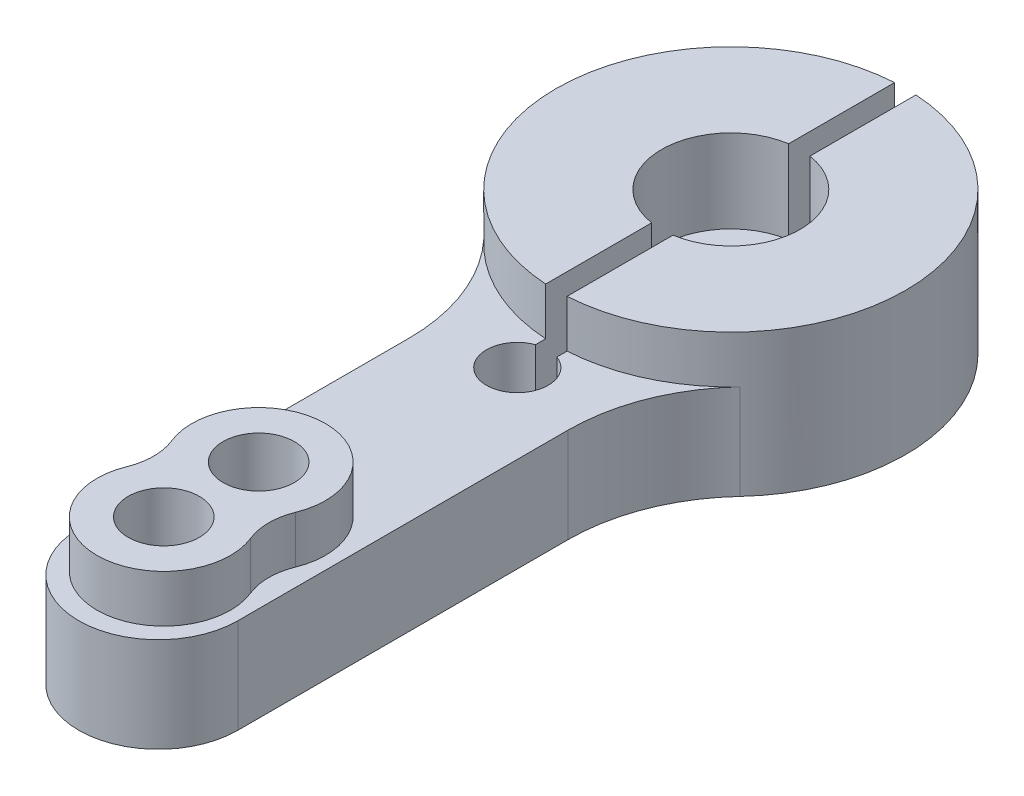
ISO-10303-21;
HEADER;
FILE_DESCRIPTION(('STEP AP214'),'2;1');
FILE_NAME('part.step','',(''),(''),'','','');
FILE_SCHEMA(('AUTOMOTIVE_DESIGN { 1 0 10303 214 1 1 1 1 }'));
ENDSEC;
DATA;
#1=APPLICATION_CONTEXT('core data for automotive mechanical design processes');
#2=APPLICATION_PROTOCOL_DEFINITION('international standard','automotive_design',2000,#1);
#3=PRODUCT_CONTEXT('',#1,'mechanical');
#4=PRODUCT('Part','Part','',(#3));
#5=PRODUCT_RELATED_PRODUCT_CATEGORY('part','',(#4));
#6=PRODUCT_DEFINITION_FORMATION('','',#4);
#7=PRODUCT_DEFINITION_CONTEXT('part definition',#1,'design');
#8=PRODUCT_DEFINITION('design','',#6,#7);
#9=PRODUCT_DEFINITION_SHAPE('','',#8);
#10=(LENGTH_UNIT() NAMED_UNIT(*) SI_UNIT(.MILLI.,.METRE.));
#11=(NAMED_UNIT(*) PLANE_ANGLE_UNIT() SI_UNIT($,.RADIAN.));
#12=(NAMED_UNIT(*) SI_UNIT($,.STERADIAN.) SOLID_ANGLE_UNIT());
#13=UNCERTAINTY_MEASURE_WITH_UNIT(LENGTH_MEASURE(1.E-05),#10,'distance_accuracy_value','');
#14=(GEOMETRIC_REPRESENTATION_CONTEXT(3) GLOBAL_UNCERTAINTY_ASSIGNED_CONTEXT((#13)) GLOBAL_UNIT_ASSIGNED_CONTEXT((#10,
#11,#12)) REPRESENTATION_CONTEXT('',''));
#15=CARTESIAN_POINT('',(0.,0.,0.));
#16=DIRECTION('',(0.,0.,1.));
#17=DIRECTION('',(1.,0.,0.));
#18=AXIS2_PLACEMENT_3D('',#15,#16,#17);
#19=CARTESIAN_POINT('',(0.,-4.,0.));
#20=DIRECTION('',(0.,1.,0.));
#21=DIRECTION('',(0.,0.,1.));
#22=AXIS2_PLACEMENT_3D('',#19,#20,#21);
#23=CYLINDRICAL_SURFACE('',#22,1.4);
#24=DIRECTION('',(0.,1.,0.));
#25=VECTOR('',#24,1.);
#26=CARTESIAN_POINT('',(-0.450000000000001,-4.,1.32570735835628));
#27=LINE('',#26,#25);
#28=CARTESIAN_POINT('',(-0.45,-2.6284,1.32570735835628));
#29=VERTEX_POINT('',#28);
#30=CARTESIAN_POINT('',(-0.45,-1.5052,1.32570735835628));
#31=VERTEX_POINT('',#30);
#32=EDGE_CURVE('E414',#29,#31,#27,.T.);
#33=ORIENTED_EDGE('',*,*,#32,.F.);
#34=CARTESIAN_POINT('',(0.,-2.6284,0.));
#35=DIRECTION('',(0.,-1.,0.));
#36=DIRECTION('',(0.,0.,-1.));
#37=AXIS2_PLACEMENT_3D('',#34,#35,#36);
#38=CIRCLE('',#37,1.4);
#39=CARTESIAN_POINT('',(-0.45,-2.6284,-1.32570735835629));
#40=VERTEX_POINT('',#39);
#41=EDGE_CURVE('E262',#29,#40,#38,.T.);
#42=ORIENTED_EDGE('',*,*,#41,.T.);
#43=DIRECTION('',(0.,1.,0.));
#44=VECTOR('',#43,1.);
#45=CARTESIAN_POINT('',(-0.45,-4.,-1.32570735835629));
#46=LINE('',#45,#44);
#47=CARTESIAN_POINT('',(-0.449999999999999,-1.5052,-1.32570735835629));
#48=VERTEX_POINT('',#47);
#49=EDGE_CURVE('E412',#40,#48,#46,.T.);
#50=ORIENTED_EDGE('',*,*,#49,.T.);
#51=CARTESIAN_POINT('',(0.,-1.5052,0.));
#52=DIRECTION('',(0.,1.,0.));
#53=DIRECTION('',(0.,0.,1.));
#54=AXIS2_PLACEMENT_3D('',#51,#52,#53);
#55=CIRCLE('',#54,1.4);
#56=EDGE_CURVE('E292',#48,#31,#55,.T.);
#57=ORIENTED_EDGE('',*,*,#56,.T.);
#58=EDGE_LOOP('',(#33,#42,#50,#57));
#59=FACE_BOUND('',#58,.T.);
#60=ADVANCED_FACE('F45',(#59),#23,.F.);
#61=CARTESIAN_POINT('',(0.,-4.,0.));
#62=DIRECTION('',(0.,1.,0.));
#63=DIRECTION('',(0.,0.,1.));
#64=AXIS2_PLACEMENT_3D('',#61,#62,#63);
#65=CYLINDRICAL_SURFACE('',#64,1.4);
#66=DIRECTION('',(0.,1.,0.));
#67=VECTOR('',#66,1.);
#68=CARTESIAN_POINT('',(0.450000000000001,-4.,-1.32570735835629));
#69=LINE('',#68,#67);
#70=CARTESIAN_POINT('',(0.450000000000001,-2.6284,-1.32570735835628));
#71=VERTEX_POINT('',#70);
#72=CARTESIAN_POINT('',(0.450000000000001,-1.5052,-1.32570735835628));
#73=VERTEX_POINT('',#72);
#74=EDGE_CURVE('E423',#71,#73,#69,.T.);
#75=ORIENTED_EDGE('',*,*,#74,.F.);
#76=CARTESIAN_POINT('',(0.,-2.6284,0.));
#77=DIRECTION('',(0.,-1.,0.));
#78=DIRECTION('',(0.,0.,-1.));
#79=AXIS2_PLACEMENT_3D('',#76,#77,#78);
#80=CIRCLE('',#79,1.4);
#81=CARTESIAN_POINT('',(0.450000000000001,-2.6284,1.32570735835628));
#82=VERTEX_POINT('',#81);
#83=EDGE_CURVE('E235',#71,#82,#80,.T.);
#84=ORIENTED_EDGE('',*,*,#83,.T.);
#85=DIRECTION('',(0.,1.,0.));
#86=VECTOR('',#85,1.);
#87=CARTESIAN_POINT('',(0.450000000000001,-4.,1.32570735835628));
#88=LINE('',#87,#86);
#89=CARTESIAN_POINT('',(0.450000000000001,-1.5052,1.32570735835629));
#90=VERTEX_POINT('',#89);
#91=EDGE_CURVE('E421',#82,#90,#88,.T.);
#92=ORIENTED_EDGE('',*,*,#91,.T.);
#93=CARTESIAN_POINT('',(0.,-1.5052,0.));
#94=DIRECTION('',(0.,1.,0.));
#95=DIRECTION('',(0.,0.,1.));
#96=AXIS2_PLACEMENT_3D('',#93,#94,#95);
#97=CIRCLE('',#96,1.4);
#98=EDGE_CURVE('E283',#90,#73,#97,.T.);
#99=ORIENTED_EDGE('',*,*,#98,.T.);
#100=EDGE_LOOP('',(#75,#84,#92,#99));
#101=FACE_BOUND('',#100,.T.);
#102=ADVANCED_FACE('F467',(#101),#65,.F.);
#103=CARTESIAN_POINT('',(0.,0.,24.13));
#104=DIRECTION('',(0.,1.,0.));
#105=DIRECTION('',(0.,0.,1.));
#106=AXIS2_PLACEMENT_3D('',#103,#104,#105);
#107=PLANE('',#106);
#108=DIRECTION('',(0.,0.,-1.));
#109=VECTOR('',#108,1.);
#110=CARTESIAN_POINT('',(3.3528,0.,24.13));
#111=LINE('',#110,#109);
#112=CARTESIAN_POINT('',(3.3528,0.,24.13));
#113=VERTEX_POINT('',#112);
#114=CARTESIAN_POINT('',(3.3528,0.,10.2067554178593));
#115=VERTEX_POINT('',#114);
#116=EDGE_CURVE('E396',#113,#115,#111,.T.);
#117=ORIENTED_EDGE('',*,*,#116,.T.);
#118=CARTESIAN_POINT('',(10.9728,0.,10.2067554178593));
#119=DIRECTION('',(0.,1.,0.));
#120=DIRECTION('',(0.,0.,1.));
#121=AXIS2_PLACEMENT_3D('',#118,#119,#120);
#122=CIRCLE('',#121,7.62);
#123=CARTESIAN_POINT('',(5.39341016949152,0.,5.01687978165965));
#124=VERTEX_POINT('',#123);
#125=EDGE_CURVE('E444',#115,#124,#122,.F.);
#126=ORIENTED_EDGE('',*,*,#125,.T.);
#127=CARTESIAN_POINT('',(0.,0.,0.));
#128=DIRECTION('',(0.,1.,0.));
#129=DIRECTION('',(0.,0.,1.));
#130=AXIS2_PLACEMENT_3D('',#127,#128,#129);
#131=CIRCLE('',#130,7.366);
#132=CARTESIAN_POINT('',(0.45,0.,7.35224156295208));
#133=VERTEX_POINT('',#132);
#134=EDGE_CURVE('E333',#133,#124,#131,.T.);
#135=ORIENTED_EDGE('',*,*,#134,.F.);
#136=DIRECTION('',(0.,0.,1.));
#137=VECTOR('',#136,1.);
#138=CARTESIAN_POINT('',(0.450000000000001,0.,1.32570735835628));
#139=LINE('',#138,#137);
#140=CARTESIAN_POINT('',(0.450000000000003,0.,7.78036890823495));
#141=VERTEX_POINT('',#140);
#142=EDGE_CURVE('E399',#133,#141,#139,.T.);
#143=ORIENTED_EDGE('',*,*,#142,.T.);
#144=CARTESIAN_POINT('',(0.,0.,9.));
#145=DIRECTION('',(0.,-1.,0.));
#146=DIRECTION('',(0.,0.,1.));
#147=AXIS2_PLACEMENT_3D('',#144,#145,#146);
#148=CIRCLE('',#147,1.3);
#149=CARTESIAN_POINT('',(-0.45,0.,7.78036890823495));
#150=VERTEX_POINT('',#149);
#151=EDGE_CURVE('E401',#141,#150,#148,.T.);
#152=ORIENTED_EDGE('',*,*,#151,.T.);
#153=DIRECTION('',(0.,0.,-1.));
#154=VECTOR('',#153,1.);
#155=CARTESIAN_POINT('',(-0.45,0.,7.78036890823495));
#156=LINE('',#155,#154);
#157=CARTESIAN_POINT('',(-0.449999999999999,0.,7.35224156295208));
#158=VERTEX_POINT('',#157);
#159=EDGE_CURVE('E404',#150,#158,#156,.T.);
#160=ORIENTED_EDGE('',*,*,#159,.T.);
#161=CARTESIAN_POINT('',(0.,0.,0.));
#162=DIRECTION('',(0.,1.,0.));
#163=DIRECTION('',(0.,0.,1.));
#164=AXIS2_PLACEMENT_3D('',#161,#162,#163);
#165=CIRCLE('',#164,7.366);
#166=CARTESIAN_POINT('',(-5.39341016949153,0.,5.01687978165965));
#167=VERTEX_POINT('',#166);
#168=EDGE_CURVE('E354',#167,#158,#165,.T.);
#169=ORIENTED_EDGE('',*,*,#168,.F.);
#170=CARTESIAN_POINT('',(-10.9728,0.,10.2067554178593));
#171=DIRECTION('',(0.,1.,0.));
#172=DIRECTION('',(0.,0.,1.));
#173=AXIS2_PLACEMENT_3D('',#170,#171,#172);
#174=CIRCLE('',#173,7.62);
#175=CARTESIAN_POINT('',(-3.3528,0.,10.2067554178593));
#176=VERTEX_POINT('',#175);
#177=EDGE_CURVE('E440',#167,#176,#174,.F.);
#178=ORIENTED_EDGE('',*,*,#177,.T.);
#179=DIRECTION('',(0.,0.,1.));
#180=VECTOR('',#179,1.);
#181=CARTESIAN_POINT('',(-3.3528,0.,24.13));
#182=LINE('',#181,#180);
#183=CARTESIAN_POINT('',(-3.3528,0.,24.13));
#184=VERTEX_POINT('',#183);
#185=EDGE_CURVE('E372',#176,#184,#182,.T.);
#186=ORIENTED_EDGE('',*,*,#185,.T.);
#187=CARTESIAN_POINT('',(0.,0.,24.13));
#188=DIRECTION('',(0.,1.,0.));
#189=DIRECTION('',(0.,0.,1.));
#190=AXIS2_PLACEMENT_3D('',#187,#188,#189);
#191=CIRCLE('',#190,3.3528);
#192=EDGE_CURVE('E367',#184,#113,#191,.T.);
#193=ORIENTED_EDGE('',*,*,#192,.T.);
#194=EDGE_LOOP('',(#117,#126,#135,#143,#152,#160,#169,#178,#186,#193));
#195=FACE_BOUND('',#194,.T.);
#196=CARTESIAN_POINT('',(0.,0.,19.9));
#197=DIRECTION('',(0.,1.,0.));
#198=DIRECTION('',(0.,0.,1.));
#199=AXIS2_PLACEMENT_3D('',#196,#197,#198);
#200=CIRCLE('',#199,2.815);
#201=CARTESIAN_POINT('',(2.61129853325274,0.,20.9513538748833));
#202=VERTEX_POINT('',#201);
#203=CARTESIAN_POINT('',(-2.61129853325274,0.,20.9513538748833));
#204=VERTEX_POINT('',#203);
#205=EDGE_CURVE('E318',#202,#204,#200,.T.);
#206=ORIENTED_EDGE('',*,*,#205,.F.);
#207=CARTESIAN_POINT('',(4.96749685455361,0.,21.9));
#208=DIRECTION('',(0.,-1.,0.));
#209=DIRECTION('',(0.,0.,1.));
#210=AXIS2_PLACEMENT_3D('',#207,#208,#209);
#211=CIRCLE('',#210,2.54);
#212=CARTESIAN_POINT('',(2.61129853325274,0.,22.8486461251167));
#213=VERTEX_POINT('',#212);
#214=EDGE_CURVE('E304',#213,#202,#211,.T.);
#215=ORIENTED_EDGE('',*,*,#214,.F.);
#216=CARTESIAN_POINT('',(0.,0.,23.9));
#217=DIRECTION('',(0.,1.,0.));
#218=DIRECTION('',(0.,0.,1.));
#219=AXIS2_PLACEMENT_3D('',#216,#217,#218);
#220=CIRCLE('',#219,2.815);
#221=CARTESIAN_POINT('',(-2.61129853325274,0.,22.8486461251167));
#222=VERTEX_POINT('',#221);
#223=EDGE_CURVE('E309',#222,#213,#220,.T.);
#224=ORIENTED_EDGE('',*,*,#223,.F.);
#225=CARTESIAN_POINT('',(-4.96749685455361,0.,21.9));
#226=DIRECTION('',(0.,-1.,0.));
#227=DIRECTION('',(0.,0.,-1.));
#228=AXIS2_PLACEMENT_3D('',#225,#226,#227);
#229=CIRCLE('',#228,2.54);
#230=EDGE_CURVE('E320',#204,#222,#229,.T.);
#231=ORIENTED_EDGE('',*,*,#230,.F.);
#232=EDGE_LOOP('',(#206,#215,#224,#231));
#233=FACE_BOUND('',#232,.T.);
#234=ADVANCED_FACE('F495',(#195,#233),#107,.T.);
#235=CARTESIAN_POINT('',(0.,-4.,24.13));
#236=DIRECTION('',(0.,1.,0.));
#237=DIRECTION('',(0.,0.,1.));
#238=AXIS2_PLACEMENT_3D('',#235,#236,#237);
#239=CYLINDRICAL_SURFACE('',#238,3.3528);
#240=ORIENTED_EDGE('',*,*,#192,.F.);
#241=DIRECTION('',(0.,1.,0.));
#242=VECTOR('',#241,1.);
#243=CARTESIAN_POINT('',(-3.3528,-4.,24.13));
#244=LINE('',#243,#242);
#245=CARTESIAN_POINT('',(-3.3528,-4.,24.13));
#246=VERTEX_POINT('',#245);
#247=EDGE_CURVE('E358',#246,#184,#244,.T.);
#248=ORIENTED_EDGE('',*,*,#247,.F.);
#249=CARTESIAN_POINT('',(0.,-4.,24.13));
#250=DIRECTION('',(0.,1.,0.));
#251=DIRECTION('',(0.,0.,1.));
#252=AXIS2_PLACEMENT_3D('',#249,#250,#251);
#253=CIRCLE('',#252,3.3528);
#254=CARTESIAN_POINT('',(3.3528,-4.,24.13));
#255=VERTEX_POINT('',#254);
#256=EDGE_CURVE('E368',#246,#255,#253,.T.);
#257=ORIENTED_EDGE('',*,*,#256,.T.);
#258=DIRECTION('',(0.,1.,0.));
#259=VECTOR('',#258,1.);
#260=CARTESIAN_POINT('',(3.3528,-4.,24.13));
#261=LINE('',#260,#259);
#262=EDGE_CURVE('E393',#255,#113,#261,.T.);
#263=ORIENTED_EDGE('',*,*,#262,.T.);
#264=EDGE_LOOP('',(#240,#248,#257,#263));
#265=FACE_BOUND('',#264,.T.);
#266=ADVANCED_FACE('F502',(#265),#239,.T.);
#267=CARTESIAN_POINT('',(-3.3528,-4.,24.13));
#268=DIRECTION('',(-1.,0.,0.));
#269=DIRECTION('',(0.,0.,1.));
#270=AXIS2_PLACEMENT_3D('',#267,#268,#269);
#271=PLANE('',#270);
#272=ORIENTED_EDGE('',*,*,#185,.F.);
#273=DIRECTION('',(0.,-1.,0.));
#274=VECTOR('',#273,1.);
#275=CARTESIAN_POINT('',(-3.3528,-4.,10.2067554178593));
#276=LINE('',#275,#274);
#277=CARTESIAN_POINT('',(-3.3528,-4.,10.2067554178593));
#278=VERTEX_POINT('',#277);
#279=EDGE_CURVE('E433',#176,#278,#276,.T.);
#280=ORIENTED_EDGE('',*,*,#279,.T.);
#281=DIRECTION('',(0.,0.,1.));
#282=VECTOR('',#281,1.);
#283=CARTESIAN_POINT('',(-3.3528,-4.,24.13));
#284=LINE('',#283,#282);
#285=EDGE_CURVE('E391',#278,#246,#284,.T.);
#286=ORIENTED_EDGE('',*,*,#285,.T.);
#287=ORIENTED_EDGE('',*,*,#247,.T.);
#288=EDGE_LOOP('',(#272,#280,#286,#287));
#289=FACE_BOUND('',#288,.T.);
#290=ADVANCED_FACE('F578',(#289),#271,.T.);
#291=CARTESIAN_POINT('',(0.,-4.,0.));
#292=DIRECTION('',(0.,1.,0.));
#293=DIRECTION('',(0.,0.,1.));
#294=AXIS2_PLACEMENT_3D('',#291,#292,#293);
#295=CYLINDRICAL_SURFACE('',#294,7.366);
#296=CARTESIAN_POINT('',(0.,-4.,0.));
#297=DIRECTION('',(0.,1.,0.));
#298=DIRECTION('',(0.,0.,1.));
#299=AXIS2_PLACEMENT_3D('',#296,#297,#298);
#300=CIRCLE('',#299,7.366);
#301=CARTESIAN_POINT('',(-0.449999999999999,-4.,-7.35224156295208));
#302=VERTEX_POINT('',#301);
#303=CARTESIAN_POINT('',(-5.39341016949153,-4.,5.01687978165965));
#304=VERTEX_POINT('',#303);
#305=EDGE_CURVE('E388',#302,#304,#300,.T.);
#306=ORIENTED_EDGE('',*,*,#305,.T.);
#307=DIRECTION('',(0.,1.,0.));
#308=VECTOR('',#307,1.);
#309=CARTESIAN_POINT('',(-5.39341016949152,-4.,5.01687978165965));
#310=LINE('',#309,#308);
#311=EDGE_CURVE('E430',#304,#167,#310,.T.);
#312=ORIENTED_EDGE('',*,*,#311,.T.);
#313=ORIENTED_EDGE('',*,*,#168,.T.);
#314=DIRECTION('',(0.,-1.,0.));
#315=VECTOR('',#314,1.);
#316=CARTESIAN_POINT('',(-0.449999999999999,2.,7.35224156295208));
#317=LINE('',#316,#315);
#318=CARTESIAN_POINT('',(-0.449999999999999,2.,7.35224156295208));
#319=VERTEX_POINT('',#318);
#320=EDGE_CURVE('E353',#319,#158,#317,.T.);
#321=ORIENTED_EDGE('',*,*,#320,.F.);
#322=CARTESIAN_POINT('',(0.,2.,0.));
#323=DIRECTION('',(0.,1.,0.));
#324=DIRECTION('',(0.,0.,1.));
#325=AXIS2_PLACEMENT_3D('',#322,#323,#324);
#326=CIRCLE('',#325,7.366);
#327=CARTESIAN_POINT('',(-0.449999999999995,2.,-7.35224156295208));
#328=VERTEX_POINT('',#327);
#329=EDGE_CURVE('E348',#328,#319,#326,.T.);
#330=ORIENTED_EDGE('',*,*,#329,.F.);
#331=DIRECTION('',(0.,1.,0.));
#332=VECTOR('',#331,1.);
#333=CARTESIAN_POINT('',(-0.449999999999999,-4.,-7.35224156295208));
#334=LINE('',#333,#332);
#335=EDGE_CURVE('E409',#302,#328,#334,.T.);
#336=ORIENTED_EDGE('',*,*,#335,.F.);
#337=EDGE_LOOP('',(#306,#312,#313,#321,#330,#336));
#338=FACE_BOUND('',#337,.T.);
#339=ADVANCED_FACE('F513',(#338),#295,.T.);
#340=CARTESIAN_POINT('',(-0.45,-4.,-1.32570735835629));
#341=DIRECTION('',(1.,0.,0.));
#342=DIRECTION('',(0.,0.,-1.));
#343=AXIS2_PLACEMENT_3D('',#340,#341,#342);
#344=PLANE('',#343);
#345=DIRECTION('',(0.,-1.,0.));
#346=VECTOR('',#345,1.);
#347=CARTESIAN_POINT('',(-0.45,-2.6284,-3.84727205302666));
#348=LINE('',#347,#346);
#349=CARTESIAN_POINT('',(-0.45,-4.,-3.84727205302666));
#350=VERTEX_POINT('',#349);
#351=CARTESIAN_POINT('',(-0.45,-2.6284,-3.84727205302666));
#352=VERTEX_POINT('',#351);
#353=EDGE_CURVE('E254',#350,#352,#348,.F.);
#354=ORIENTED_EDGE('',*,*,#353,.F.);
#355=DIRECTION('',(0.,0.,-1.));
#356=VECTOR('',#355,1.);
#357=CARTESIAN_POINT('',(-0.45,-4.,-1.32570735835629));
#358=LINE('',#357,#356);
#359=EDGE_CURVE('E386',#350,#302,#358,.T.);
#360=ORIENTED_EDGE('',*,*,#359,.T.);
#361=ORIENTED_EDGE('',*,*,#335,.T.);
#362=DIRECTION('',(0.,0.,-1.));
#363=VECTOR('',#362,1.);
#364=CARTESIAN_POINT('',(-0.449999999999999,2.,-7.35224156295208));
#365=LINE('',#364,#363);
#366=CARTESIAN_POINT('',(-0.449999999999999,2.,-2.88612906849295));
#367=VERTEX_POINT('',#366);
#368=EDGE_CURVE('E346',#367,#328,#365,.T.);
#369=ORIENTED_EDGE('',*,*,#368,.F.);
#370=DIRECTION('',(0.,1.,0.));
#371=VECTOR('',#370,1.);
#372=CARTESIAN_POINT('',(-0.45,-1.5052,-2.88612906849295));
#373=LINE('',#372,#371);
#374=CARTESIAN_POINT('',(-0.45,-1.5052,-2.88612906849295));
#375=VERTEX_POINT('',#374);
#376=EDGE_CURVE('E281',#375,#367,#373,.T.);
#377=ORIENTED_EDGE('',*,*,#376,.F.);
#378=DIRECTION('',(0.,0.,1.));
#379=VECTOR('',#378,1.);
#380=CARTESIAN_POINT('',(-0.45,-1.5052,-1.32570735835629));
#381=LINE('',#380,#379);
#382=EDGE_CURVE('E295',#375,#48,#381,.T.);
#383=ORIENTED_EDGE('',*,*,#382,.T.);
#384=ORIENTED_EDGE('',*,*,#49,.F.);
#385=DIRECTION('',(0.,0.,-1.));
#386=VECTOR('',#385,1.);
#387=CARTESIAN_POINT('',(-0.45,-2.6284,-1.32570735835629));
#388=LINE('',#387,#386);
#389=EDGE_CURVE('E265',#40,#352,#388,.T.);
#390=ORIENTED_EDGE('',*,*,#389,.T.);
#391=EDGE_LOOP('',(#354,#360,#361,#369,#377,#383,#384,#390));
#392=FACE_BOUND('',#391,.T.);
#393=ADVANCED_FACE('F519',(#392),#344,.T.);
#394=CARTESIAN_POINT('',(-0.45,-4.,7.78036890823495));
#395=DIRECTION('',(1.,0.,0.));
#396=DIRECTION('',(0.,0.,-1.));
#397=AXIS2_PLACEMENT_3D('',#394,#395,#396);
#398=PLANE('',#397);
#399=DIRECTION('',(0.,-1.,0.));
#400=VECTOR('',#399,1.);
#401=CARTESIAN_POINT('',(-0.45,-2.6284,3.84727205302666));
#402=LINE('',#401,#400);
#403=CARTESIAN_POINT('',(-0.45,-2.6284,3.84727205302666));
#404=VERTEX_POINT('',#403);
#405=CARTESIAN_POINT('',(-0.45,-4.,3.84727205302666));
#406=VERTEX_POINT('',#405);
#407=EDGE_CURVE('E68',#404,#406,#402,.T.);
#408=ORIENTED_EDGE('',*,*,#407,.F.);
#409=DIRECTION('',(0.,0.,-1.));
#410=VECTOR('',#409,1.);
#411=CARTESIAN_POINT('',(-0.45,-2.6284,7.78036890823495));
#412=LINE('',#411,#410);
#413=EDGE_CURVE('E259',#404,#29,#412,.T.);
#414=ORIENTED_EDGE('',*,*,#413,.T.);
#415=ORIENTED_EDGE('',*,*,#32,.T.);
#416=DIRECTION('',(0.,0.,1.));
#417=VECTOR('',#416,1.);
#418=CARTESIAN_POINT('',(-0.45,-1.5052,7.78036890823495));
#419=LINE('',#418,#417);
#420=CARTESIAN_POINT('',(-0.45,-1.5052,2.88612906849295));
#421=VERTEX_POINT('',#420);
#422=EDGE_CURVE('E289',#31,#421,#419,.T.);
#423=ORIENTED_EDGE('',*,*,#422,.T.);
#424=DIRECTION('',(0.,1.,0.));
#425=VECTOR('',#424,1.);
#426=CARTESIAN_POINT('',(-0.45,-1.5052,2.88612906849295));
#427=LINE('',#426,#425);
#428=CARTESIAN_POINT('',(-0.449999999999999,2.,2.88612906849295));
#429=VERTEX_POINT('',#428);
#430=EDGE_CURVE('E279',#429,#421,#427,.F.);
#431=ORIENTED_EDGE('',*,*,#430,.F.);
#432=DIRECTION('',(0.,0.,-1.));
#433=VECTOR('',#432,1.);
#434=CARTESIAN_POINT('',(-0.449999999999999,2.,1.32570735835628));
#435=LINE('',#434,#433);
#436=EDGE_CURVE('E350',#319,#429,#435,.T.);
#437=ORIENTED_EDGE('',*,*,#436,.F.);
#438=ORIENTED_EDGE('',*,*,#320,.T.);
#439=ORIENTED_EDGE('',*,*,#159,.F.);
#440=DIRECTION('',(0.,1.,0.));
#441=VECTOR('',#440,1.);
#442=CARTESIAN_POINT('',(-0.45,-4.,7.78036890823495));
#443=LINE('',#442,#441);
#444=CARTESIAN_POINT('',(-0.45,-4.,7.78036890823495));
#445=VERTEX_POINT('',#444);
#446=EDGE_CURVE('E416',#445,#150,#443,.T.);
#447=ORIENTED_EDGE('',*,*,#446,.F.);
#448=DIRECTION('',(0.,0.,-1.));
#449=VECTOR('',#448,1.);
#450=CARTESIAN_POINT('',(-0.45,-4.,7.78036890823495));
#451=LINE('',#450,#449);
#452=EDGE_CURVE('E383',#445,#406,#451,.T.);
#453=ORIENTED_EDGE('',*,*,#452,.T.);
#454=EDGE_LOOP('',(#408,#414,#415,#423,#431,#437,#438,#439,#447,#453));
#455=FACE_BOUND('',#454,.T.);
#456=ADVANCED_FACE('F457',(#455),#398,.T.);
#457=CARTESIAN_POINT('',(0.,-4.,9.));
#458=DIRECTION('',(0.,1.,0.));
#459=DIRECTION('',(0.,0.,1.));
#460=AXIS2_PLACEMENT_3D('',#457,#458,#459);
#461=CYLINDRICAL_SURFACE('',#460,1.3);
#462=ORIENTED_EDGE('',*,*,#151,.F.);
#463=DIRECTION('',(0.,1.,0.));
#464=VECTOR('',#463,1.);
#465=CARTESIAN_POINT('',(0.450000000000003,-4.,7.78036890823495));
#466=LINE('',#465,#464);
#467=CARTESIAN_POINT('',(0.450000000000003,-4.,7.78036890823495));
#468=VERTEX_POINT('',#467);
#469=EDGE_CURVE('E418',#468,#141,#466,.T.);
#470=ORIENTED_EDGE('',*,*,#469,.F.);
#471=CARTESIAN_POINT('',(0.,-4.,9.));
#472=DIRECTION('',(0.,-1.,0.));
#473=DIRECTION('',(0.,0.,1.));
#474=AXIS2_PLACEMENT_3D('',#471,#472,#473);
#475=CIRCLE('',#474,1.3);
#476=EDGE_CURVE('E380',#468,#445,#475,.T.);
#477=ORIENTED_EDGE('',*,*,#476,.T.);
#478=ORIENTED_EDGE('',*,*,#446,.T.);
#479=EDGE_LOOP('',(#462,#470,#477,#478));
#480=FACE_BOUND('',#479,.T.);
#481=ADVANCED_FACE('F461',(#480),#461,.F.);
#482=CARTESIAN_POINT('',(0.450000000000001,-4.,1.32570735835628));
#483=DIRECTION('',(-1.,0.,0.));
#484=DIRECTION('',(0.,0.,1.));
#485=AXIS2_PLACEMENT_3D('',#482,#483,#484);
#486=PLANE('',#485);
#487=DIRECTION('',(0.,-1.,0.));
#488=VECTOR('',#487,1.);
#489=CARTESIAN_POINT('',(0.450000000000001,-2.6284,3.84727205302666));
#490=LINE('',#489,#488);
#491=CARTESIAN_POINT('',(0.450000000000001,-4.,3.84727205302666));
#492=VERTEX_POINT('',#491);
#493=CARTESIAN_POINT('',(0.450000000000001,-2.6284,3.84727205302666));
#494=VERTEX_POINT('',#493);
#495=EDGE_CURVE('E240',#492,#494,#490,.F.);
#496=ORIENTED_EDGE('',*,*,#495,.F.);
#497=DIRECTION('',(0.,0.,1.));
#498=VECTOR('',#497,1.);
#499=CARTESIAN_POINT('',(0.450000000000001,-4.,1.32570735835628));
#500=LINE('',#499,#498);
#501=EDGE_CURVE('E378',#492,#468,#500,.T.);
#502=ORIENTED_EDGE('',*,*,#501,.T.);
#503=ORIENTED_EDGE('',*,*,#469,.T.);
#504=ORIENTED_EDGE('',*,*,#142,.F.);
#505=DIRECTION('',(0.,-1.,0.));
#506=VECTOR('',#505,1.);
#507=CARTESIAN_POINT('',(0.45,2.,7.35224156295208));
#508=LINE('',#507,#506);
#509=CARTESIAN_POINT('',(0.45,2.,7.35224156295208));
#510=VERTEX_POINT('',#509);
#511=EDGE_CURVE('E342',#510,#133,#508,.T.);
#512=ORIENTED_EDGE('',*,*,#511,.F.);
#513=DIRECTION('',(0.,0.,1.));
#514=VECTOR('',#513,1.);
#515=CARTESIAN_POINT('',(0.45,2.,1.32570735835628));
#516=LINE('',#515,#514);
#517=CARTESIAN_POINT('',(0.45,2.,2.88612906849295));
#518=VERTEX_POINT('',#517);
#519=EDGE_CURVE('E340',#518,#510,#516,.T.);
#520=ORIENTED_EDGE('',*,*,#519,.F.);
#521=DIRECTION('',(0.,1.,0.));
#522=VECTOR('',#521,1.);
#523=CARTESIAN_POINT('',(0.450000000000001,-1.5052,2.88612906849295));
#524=LINE('',#523,#522);
#525=CARTESIAN_POINT('',(0.450000000000001,-1.5052,2.88612906849295));
#526=VERTEX_POINT('',#525);
#527=EDGE_CURVE('E277',#526,#518,#524,.T.);
#528=ORIENTED_EDGE('',*,*,#527,.F.);
#529=DIRECTION('',(0.,0.,-1.));
#530=VECTOR('',#529,1.);
#531=CARTESIAN_POINT('',(0.450000000000001,-1.5052,1.32570735835628));
#532=LINE('',#531,#530);
#533=EDGE_CURVE('E286',#526,#90,#532,.T.);
#534=ORIENTED_EDGE('',*,*,#533,.T.);
#535=ORIENTED_EDGE('',*,*,#91,.F.);
#536=DIRECTION('',(0.,0.,1.));
#537=VECTOR('',#536,1.);
#538=CARTESIAN_POINT('',(0.450000000000001,-2.6284,1.32570735835628));
#539=LINE('',#538,#537);
#540=EDGE_CURVE('E257',#82,#494,#539,.T.);
#541=ORIENTED_EDGE('',*,*,#540,.T.);
#542=EDGE_LOOP('',(#496,#502,#503,#504,#512,#520,#528,#534,#535,#541));
#543=FACE_BOUND('',#542,.T.);
#544=ADVANCED_FACE('F464',(#543),#486,.T.);
#545=CARTESIAN_POINT('',(0.45,-4.,-7.35224156295208));
#546=DIRECTION('',(-1.,0.,0.));
#547=DIRECTION('',(0.,0.,1.));
#548=AXIS2_PLACEMENT_3D('',#545,#546,#547);
#549=PLANE('',#548);
#550=DIRECTION('',(0.,-1.,0.));
#551=VECTOR('',#550,1.);
#552=CARTESIAN_POINT('',(0.45,-2.6284,-3.84727205302666));
#553=LINE('',#552,#551);
#554=CARTESIAN_POINT('',(0.45,-2.6284,-3.84727205302666));
#555=VERTEX_POINT('',#554);
#556=CARTESIAN_POINT('',(0.45,-4.,-3.84727205302666));
#557=VERTEX_POINT('',#556);
#558=EDGE_CURVE('E60',#555,#557,#553,.T.);
#559=ORIENTED_EDGE('',*,*,#558,.F.);
#560=DIRECTION('',(0.,0.,1.));
#561=VECTOR('',#560,1.);
#562=CARTESIAN_POINT('',(0.45,-2.6284,-7.35224156295208));
#563=LINE('',#562,#561);
#564=EDGE_CURVE('E11',#555,#71,#563,.T.);
#565=ORIENTED_EDGE('',*,*,#564,.T.);
#566=ORIENTED_EDGE('',*,*,#74,.T.);
#567=DIRECTION('',(0.,0.,-1.));
#568=VECTOR('',#567,1.);
#569=CARTESIAN_POINT('',(0.45,-1.5052,-7.35224156295208));
#570=LINE('',#569,#568);
#571=CARTESIAN_POINT('',(0.450000000000001,-1.5052,-2.88612906849295));
#572=VERTEX_POINT('',#571);
#573=EDGE_CURVE('E357',#73,#572,#570,.T.);
#574=ORIENTED_EDGE('',*,*,#573,.T.);
#575=DIRECTION('',(0.,1.,0.));
#576=VECTOR('',#575,1.);
#577=CARTESIAN_POINT('',(0.450000000000001,-1.5052,-2.88612906849295));
#578=LINE('',#577,#576);
#579=CARTESIAN_POINT('',(0.45,2.,-2.88612906849295));
#580=VERTEX_POINT('',#579);
#581=EDGE_CURVE('E272',#580,#572,#578,.F.);
#582=ORIENTED_EDGE('',*,*,#581,.F.);
#583=DIRECTION('',(0.,0.,1.));
#584=VECTOR('',#583,1.);
#585=CARTESIAN_POINT('',(0.45,2.,-7.35224156295208));
#586=LINE('',#585,#584);
#587=CARTESIAN_POINT('',(0.45,2.,-7.35224156295208));
#588=VERTEX_POINT('',#587);
#589=EDGE_CURVE('E337',#588,#580,#586,.T.);
#590=ORIENTED_EDGE('',*,*,#589,.F.);
#591=DIRECTION('',(0.,1.,0.));
#592=VECTOR('',#591,1.);
#593=CARTESIAN_POINT('',(0.45,-4.,-7.35224156295208));
#594=LINE('',#593,#592);
#595=CARTESIAN_POINT('',(0.45,-4.,-7.35224156295208));
#596=VERTEX_POINT('',#595);
#597=EDGE_CURVE('E425',#596,#588,#594,.T.);
#598=ORIENTED_EDGE('',*,*,#597,.F.);
#599=DIRECTION('',(0.,0.,1.));
#600=VECTOR('',#599,1.);
#601=CARTESIAN_POINT('',(0.45,-4.,-7.35224156295208));
#602=LINE('',#601,#600);
#603=EDGE_CURVE('E247',#596,#557,#602,.T.);
#604=ORIENTED_EDGE('',*,*,#603,.T.);
#605=EDGE_LOOP('',(#559,#565,#566,#574,#582,#590,#598,#604));
#606=FACE_BOUND('',#605,.T.);
#607=ADVANCED_FACE('F244',(#606),#549,.T.);
#608=CARTESIAN_POINT('',(0.,-4.,0.));
#609=DIRECTION('',(0.,1.,0.));
#610=DIRECTION('',(0.,0.,1.));
#611=AXIS2_PLACEMENT_3D('',#608,#609,#610);
#612=CYLINDRICAL_SURFACE('',#611,7.366);
#613=ORIENTED_EDGE('',*,*,#134,.T.);
#614=DIRECTION('',(0.,1.,0.));
#615=VECTOR('',#614,1.);
#616=CARTESIAN_POINT('',(5.39341016949152,-4.,5.01687978165965));
#617=LINE('',#616,#615);
#618=CARTESIAN_POINT('',(5.39341016949153,-4.,5.01687978165965));
#619=VERTEX_POINT('',#618);
#620=EDGE_CURVE('E438',#124,#619,#617,.F.);
#621=ORIENTED_EDGE('',*,*,#620,.T.);
#622=CARTESIAN_POINT('',(0.,-4.,0.));
#623=DIRECTION('',(0.,1.,0.));
#624=DIRECTION('',(0.,0.,1.));
#625=AXIS2_PLACEMENT_3D('',#622,#623,#624);
#626=CIRCLE('',#625,7.366);
#627=EDGE_CURVE('E375',#619,#596,#626,.T.);
#628=ORIENTED_EDGE('',*,*,#627,.T.);
#629=ORIENTED_EDGE('',*,*,#597,.T.);
#630=CARTESIAN_POINT('',(0.,2.,0.));
#631=DIRECTION('',(0.,1.,0.));
#632=DIRECTION('',(0.,0.,1.));
#633=AXIS2_PLACEMENT_3D('',#630,#631,#632);
#634=CIRCLE('',#633,7.366);
#635=EDGE_CURVE('E334',#510,#588,#634,.T.);
#636=ORIENTED_EDGE('',*,*,#635,.F.);
#637=ORIENTED_EDGE('',*,*,#511,.T.);
#638=EDGE_LOOP('',(#613,#621,#628,#629,#636,#637));
#639=FACE_BOUND('',#638,.T.);
#640=ADVANCED_FACE('F572',(#639),#612,.T.);
#641=CARTESIAN_POINT('',(3.3528,-4.,24.13));
#642=DIRECTION('',(1.,0.,0.));
#643=DIRECTION('',(0.,0.,-1.));
#644=AXIS2_PLACEMENT_3D('',#641,#642,#643);
#645=PLANE('',#644);
#646=DIRECTION('',(0.,0.,-1.));
#647=VECTOR('',#646,1.);
#648=CARTESIAN_POINT('',(3.3528,-4.,24.13));
#649=LINE('',#648,#647);
#650=CARTESIAN_POINT('',(3.3528,-4.,10.2067554178593));
#651=VERTEX_POINT('',#650);
#652=EDGE_CURVE('E371',#255,#651,#649,.T.);
#653=ORIENTED_EDGE('',*,*,#652,.T.);
#654=DIRECTION('',(0.,-1.,0.));
#655=VECTOR('',#654,1.);
#656=CARTESIAN_POINT('',(3.3528,0.,10.2067554178593));
#657=LINE('',#656,#655);
#658=EDGE_CURVE('E435',#651,#115,#657,.F.);
#659=ORIENTED_EDGE('',*,*,#658,.T.);
#660=ORIENTED_EDGE('',*,*,#116,.F.);
#661=ORIENTED_EDGE('',*,*,#262,.F.);
#662=EDGE_LOOP('',(#653,#659,#660,#661));
#663=FACE_BOUND('',#662,.T.);
#664=ADVANCED_FACE('F493',(#663),#645,.T.);
#665=CARTESIAN_POINT('',(0.,-4.,24.13));
#666=DIRECTION('',(0.,1.,0.));
#667=DIRECTION('',(0.,0.,1.));
#668=AXIS2_PLACEMENT_3D('',#665,#666,#667);
#669=PLANE('',#668);
#670=CARTESIAN_POINT('',(0.,-4.,23.9));
#671=DIRECTION('',(0.,1.,0.));
#672=DIRECTION('',(0.,0.,1.));
#673=AXIS2_PLACEMENT_3D('',#670,#671,#672);
#674=CIRCLE('',#673,1.5);
#675=CARTESIAN_POINT('',(0.,-4.,25.4));
#676=VERTEX_POINT('',#675);
#677=EDGE_CURVE('E361',#676,#676,#674,.T.);
#678=ORIENTED_EDGE('',*,*,#677,.T.);
#679=EDGE_LOOP('',(#678));
#680=FACE_BOUND('',#679,.T.);
#681=CARTESIAN_POINT('',(0.,-4.,19.9));
#682=DIRECTION('',(0.,1.,0.));
#683=DIRECTION('',(0.,0.,1.));
#684=AXIS2_PLACEMENT_3D('',#681,#682,#683);
#685=CIRCLE('',#684,1.5);
#686=CARTESIAN_POINT('',(0.,-4.,21.4));
#687=VERTEX_POINT('',#686);
#688=EDGE_CURVE('E364',#687,#687,#685,.T.);
#689=ORIENTED_EDGE('',*,*,#688,.T.);
#690=EDGE_LOOP('',(#689));
#691=FACE_BOUND('',#690,.T.);
#692=ORIENTED_EDGE('',*,*,#501,.F.);
#693=CARTESIAN_POINT('',(0.,-4.,0.));
#694=DIRECTION('',(0.,-1.,0.));
#695=DIRECTION('',(0.,0.,-1.));
#696=AXIS2_PLACEMENT_3D('',#693,#694,#695);
#697=CIRCLE('',#696,3.8735);
#698=EDGE_CURVE('E251',#557,#492,#697,.T.);
#699=ORIENTED_EDGE('',*,*,#698,.F.);
#700=ORIENTED_EDGE('',*,*,#603,.F.);
#701=ORIENTED_EDGE('',*,*,#627,.F.);
#702=CARTESIAN_POINT('',(10.9728,-4.,10.2067554178593));
#703=DIRECTION('',(0.,1.,0.));
#704=DIRECTION('',(0.,0.,1.));
#705=AXIS2_PLACEMENT_3D('',#702,#703,#704);
#706=CIRCLE('',#705,7.62);
#707=EDGE_CURVE('E447',#619,#651,#706,.T.);
#708=ORIENTED_EDGE('',*,*,#707,.T.);
#709=ORIENTED_EDGE('',*,*,#652,.F.);
#710=ORIENTED_EDGE('',*,*,#256,.F.);
#711=ORIENTED_EDGE('',*,*,#285,.F.);
#712=CARTESIAN_POINT('',(-10.9728,-4.,10.2067554178593));
#713=DIRECTION('',(0.,1.,0.));
#714=DIRECTION('',(0.,0.,1.));
#715=AXIS2_PLACEMENT_3D('',#712,#713,#714);
#716=CIRCLE('',#715,7.62);
#717=EDGE_CURVE('E442',#278,#304,#716,.T.);
#718=ORIENTED_EDGE('',*,*,#717,.T.);
#719=ORIENTED_EDGE('',*,*,#305,.F.);
#720=ORIENTED_EDGE('',*,*,#359,.F.);
#721=CARTESIAN_POINT('',(0.,-4.,0.));
#722=DIRECTION('',(0.,1.,0.));
#723=DIRECTION('',(0.,0.,1.));
#724=AXIS2_PLACEMENT_3D('',#721,#722,#723);
#725=CIRCLE('',#724,3.8735);
#726=EDGE_CURVE('E53',#350,#406,#725,.T.);
#727=ORIENTED_EDGE('',*,*,#726,.T.);
#728=ORIENTED_EDGE('',*,*,#452,.F.);
#729=ORIENTED_EDGE('',*,*,#476,.F.);
#730=EDGE_LOOP('',(#692,#699,#700,#701,#708,#709,#710,#711,#718,#719,#720,#727,#728,#729));
#731=FACE_BOUND('',#730,.T.);
#732=ADVANCED_FACE('F452',(#680,#691,#731),#669,.F.);
#733=CARTESIAN_POINT('',(0.,-4.,19.9));
#734=DIRECTION('',(0.,1.,0.));
#735=DIRECTION('',(0.,0.,1.));
#736=AXIS2_PLACEMENT_3D('',#733,#734,#735);
#737=CYLINDRICAL_SURFACE('',#736,1.5);
#738=ORIENTED_EDGE('',*,*,#688,.F.);
#739=EDGE_LOOP('',(#738));
#740=FACE_BOUND('',#739,.T.);
#741=CARTESIAN_POINT('',(0.,2.,19.9));
#742=DIRECTION('',(0.,1.,0.));
#743=DIRECTION('',(0.,0.,1.));
#744=AXIS2_PLACEMENT_3D('',#741,#742,#743);
#745=CIRCLE('',#744,1.5);
#746=CARTESIAN_POINT('',(0.,2.,21.4));
#747=VERTEX_POINT('',#746);
#748=EDGE_CURVE('E301',#747,#747,#745,.T.);
#749=ORIENTED_EDGE('',*,*,#748,.T.);
#750=EDGE_LOOP('',(#749));
#751=FACE_BOUND('',#750,.T.);
#752=ADVANCED_FACE('F551',(#740,#751),#737,.F.);
#753=CARTESIAN_POINT('',(0.,-4.,23.9));
#754=DIRECTION('',(0.,1.,0.));
#755=DIRECTION('',(0.,0.,1.));
#756=AXIS2_PLACEMENT_3D('',#753,#754,#755);
#757=CYLINDRICAL_SURFACE('',#756,1.5);
#758=ORIENTED_EDGE('',*,*,#677,.F.);
#759=EDGE_LOOP('',(#758));
#760=FACE_BOUND('',#759,.T.);
#761=CARTESIAN_POINT('',(0.,2.,23.9));
#762=DIRECTION('',(0.,1.,0.));
#763=DIRECTION('',(0.,0.,1.));
#764=AXIS2_PLACEMENT_3D('',#761,#762,#763);
#765=CIRCLE('',#764,1.5);
#766=CARTESIAN_POINT('',(0.,2.,25.4));
#767=VERTEX_POINT('',#766);
#768=EDGE_CURVE('E298',#767,#767,#765,.T.);
#769=ORIENTED_EDGE('',*,*,#768,.T.);
#770=EDGE_LOOP('',(#769));
#771=FACE_BOUND('',#770,.T.);
#772=ADVANCED_FACE('F542',(#760,#771),#757,.F.);
#773=CARTESIAN_POINT('',(0.,2.,0.));
#774=DIRECTION('',(0.,1.,0.));
#775=DIRECTION('',(0.,0.,1.));
#776=AXIS2_PLACEMENT_3D('',#773,#774,#775);
#777=PLANE('',#776);
#778=CARTESIAN_POINT('',(0.,2.,0.));
#779=DIRECTION('',(0.,1.,0.));
#780=DIRECTION('',(0.,0.,1.));
#781=AXIS2_PLACEMENT_3D('',#778,#779,#780);
#782=CIRCLE('',#781,2.921);
#783=EDGE_CURVE('E268',#367,#429,#782,.T.);
#784=ORIENTED_EDGE('',*,*,#783,.F.);
#785=ORIENTED_EDGE('',*,*,#368,.T.);
#786=ORIENTED_EDGE('',*,*,#329,.T.);
#787=ORIENTED_EDGE('',*,*,#436,.T.);
#788=EDGE_LOOP('',(#784,#785,#786,#787));
#789=FACE_BOUND('',#788,.T.);
#790=ADVANCED_FACE('F539',(#789),#777,.T.);
#791=CARTESIAN_POINT('',(0.,2.,0.));
#792=DIRECTION('',(0.,1.,0.));
#793=DIRECTION('',(0.,0.,1.));
#794=AXIS2_PLACEMENT_3D('',#791,#792,#793);
#795=PLANE('',#794);
#796=EDGE_CURVE('E274',#518,#580,#782,.T.);
#797=ORIENTED_EDGE('',*,*,#796,.F.);
#798=ORIENTED_EDGE('',*,*,#519,.T.);
#799=ORIENTED_EDGE('',*,*,#635,.T.);
#800=ORIENTED_EDGE('',*,*,#589,.T.);
#801=EDGE_LOOP('',(#797,#798,#799,#800));
#802=FACE_BOUND('',#801,.T.);
#803=ADVANCED_FACE('F482',(#802),#795,.T.);
#804=CARTESIAN_POINT('',(2.4837484272768,2.,22.9));
#805=DIRECTION('',(0.,1.,0.));
#806=DIRECTION('',(0.,0.,1.));
#807=AXIS2_PLACEMENT_3D('',#804,#805,#806);
#808=PLANE('',#807);
#809=ORIENTED_EDGE('',*,*,#748,.F.);
#810=EDGE_LOOP('',(#809));
#811=FACE_BOUND('',#810,.T.);
#812=CARTESIAN_POINT('',(4.96749685455361,2.,21.9));
#813=DIRECTION('',(0.,-1.,0.));
#814=DIRECTION('',(0.,0.,1.));
#815=AXIS2_PLACEMENT_3D('',#812,#813,#814);
#816=CIRCLE('',#815,2.54);
#817=CARTESIAN_POINT('',(2.61129853325274,2.,22.8486461251167));
#818=VERTEX_POINT('',#817);
#819=CARTESIAN_POINT('',(2.61129853325274,2.,20.9513538748833));
#820=VERTEX_POINT('',#819);
#821=EDGE_CURVE('E305',#818,#820,#816,.T.);
#822=ORIENTED_EDGE('',*,*,#821,.T.);
#823=CARTESIAN_POINT('',(0.,2.,19.9));
#824=DIRECTION('',(0.,1.,0.));
#825=DIRECTION('',(0.,0.,1.));
#826=AXIS2_PLACEMENT_3D('',#823,#824,#825);
#827=CIRCLE('',#826,2.815);
#828=CARTESIAN_POINT('',(-2.61129853325274,2.,20.9513538748833));
#829=VERTEX_POINT('',#828);
#830=EDGE_CURVE('E308',#820,#829,#827,.T.);
#831=ORIENTED_EDGE('',*,*,#830,.T.);
#832=CARTESIAN_POINT('',(-4.96749685455361,2.,21.9));
#833=DIRECTION('',(0.,-1.,0.));
#834=DIRECTION('',(0.,0.,-1.));
#835=AXIS2_PLACEMENT_3D('',#832,#833,#834);
#836=CIRCLE('',#835,2.54);
#837=CARTESIAN_POINT('',(-2.61129853325274,2.,22.8486461251167));
#838=VERTEX_POINT('',#837);
#839=EDGE_CURVE('E311',#829,#838,#836,.T.);
#840=ORIENTED_EDGE('',*,*,#839,.T.);
#841=CARTESIAN_POINT('',(0.,2.,23.9));
#842=DIRECTION('',(0.,1.,0.));
#843=DIRECTION('',(0.,0.,1.));
#844=AXIS2_PLACEMENT_3D('',#841,#842,#843);
#845=CIRCLE('',#844,2.815);
#846=EDGE_CURVE('E313',#838,#818,#845,.T.);
#847=ORIENTED_EDGE('',*,*,#846,.T.);
#848=EDGE_LOOP('',(#822,#831,#840,#847));
#849=FACE_BOUND('',#848,.T.);
#850=ORIENTED_EDGE('',*,*,#768,.F.);
#851=EDGE_LOOP('',(#850));
#852=FACE_BOUND('',#851,.T.);
#853=ADVANCED_FACE('F548',(#811,#849,#852),#808,.T.);
#854=CARTESIAN_POINT('',(4.96749685455361,2.,21.9));
#855=DIRECTION('',(0.,-1.,0.));
#856=DIRECTION('',(0.,0.,-1.));
#857=AXIS2_PLACEMENT_3D('',#854,#855,#856);
#858=CYLINDRICAL_SURFACE('',#857,2.54);
#859=ORIENTED_EDGE('',*,*,#214,.T.);
#860=DIRECTION('',(0.,-1.,0.));
#861=VECTOR('',#860,1.);
#862=CARTESIAN_POINT('',(2.61129853325274,2.,20.9513538748833));
#863=LINE('',#862,#861);
#864=EDGE_CURVE('E331',#820,#202,#863,.T.);
#865=ORIENTED_EDGE('',*,*,#864,.F.);
#866=ORIENTED_EDGE('',*,*,#821,.F.);
#867=DIRECTION('',(0.,-1.,0.));
#868=VECTOR('',#867,1.);
#869=CARTESIAN_POINT('',(2.61129853325274,2.,22.8486461251167));
#870=LINE('',#869,#868);
#871=EDGE_CURVE('E315',#818,#213,#870,.T.);
#872=ORIENTED_EDGE('',*,*,#871,.T.);
#873=EDGE_LOOP('',(#859,#865,#866,#872));
#874=FACE_BOUND('',#873,.T.);
#875=ADVANCED_FACE('F607',(#874),#858,.F.);
#876=CARTESIAN_POINT('',(0.,2.,19.9));
#877=DIRECTION('',(0.,-1.,0.));
#878=DIRECTION('',(0.,0.,-1.));
#879=AXIS2_PLACEMENT_3D('',#876,#877,#878);
#880=CYLINDRICAL_SURFACE('',#879,2.815);
#881=ORIENTED_EDGE('',*,*,#205,.T.);
#882=DIRECTION('',(0.,-1.,0.));
#883=VECTOR('',#882,1.);
#884=CARTESIAN_POINT('',(-2.61129853325274,2.,20.9513538748833));
#885=LINE('',#884,#883);
#886=EDGE_CURVE('E328',#829,#204,#885,.T.);
#887=ORIENTED_EDGE('',*,*,#886,.F.);
#888=ORIENTED_EDGE('',*,*,#830,.F.);
#889=ORIENTED_EDGE('',*,*,#864,.T.);
#890=EDGE_LOOP('',(#881,#887,#888,#889));
#891=FACE_BOUND('',#890,.T.);
#892=ADVANCED_FACE('F601',(#891),#880,.T.);
#893=CARTESIAN_POINT('',(-4.96749685455361,2.,21.9));
#894=DIRECTION('',(0.,-1.,0.));
#895=DIRECTION('',(0.,0.,-1.));
#896=AXIS2_PLACEMENT_3D('',#893,#894,#895);
#897=CYLINDRICAL_SURFACE('',#896,2.54);
#898=ORIENTED_EDGE('',*,*,#230,.T.);
#899=DIRECTION('',(0.,-1.,0.));
#900=VECTOR('',#899,1.);
#901=CARTESIAN_POINT('',(-2.61129853325274,2.,22.8486461251167));
#902=LINE('',#901,#900);
#903=EDGE_CURVE('E326',#838,#222,#902,.T.);
#904=ORIENTED_EDGE('',*,*,#903,.F.);
#905=ORIENTED_EDGE('',*,*,#839,.F.);
#906=ORIENTED_EDGE('',*,*,#886,.T.);
#907=EDGE_LOOP('',(#898,#904,#905,#906));
#908=FACE_BOUND('',#907,.T.);
#909=ADVANCED_FACE('F595',(#908),#897,.F.);
#910=CARTESIAN_POINT('',(0.,2.,23.9));
#911=DIRECTION('',(0.,-1.,0.));
#912=DIRECTION('',(0.,0.,-1.));
#913=AXIS2_PLACEMENT_3D('',#910,#911,#912);
#914=CYLINDRICAL_SURFACE('',#913,2.815);
#915=ORIENTED_EDGE('',*,*,#223,.T.);
#916=ORIENTED_EDGE('',*,*,#871,.F.);
#917=ORIENTED_EDGE('',*,*,#846,.F.);
#918=ORIENTED_EDGE('',*,*,#903,.T.);
#919=EDGE_LOOP('',(#915,#916,#917,#918));
#920=FACE_BOUND('',#919,.T.);
#921=ADVANCED_FACE('F591',(#920),#914,.T.);
#922=CARTESIAN_POINT('',(0.,-1.5052,0.));
#923=DIRECTION('',(0.,1.,0.));
#924=DIRECTION('',(0.,0.,1.));
#925=AXIS2_PLACEMENT_3D('',#922,#923,#924);
#926=CYLINDRICAL_SURFACE('',#925,2.921);
#927=ORIENTED_EDGE('',*,*,#527,.T.);
#928=ORIENTED_EDGE('',*,*,#796,.T.);
#929=ORIENTED_EDGE('',*,*,#581,.T.);
#930=CARTESIAN_POINT('',(0.,-1.5052,0.));
#931=DIRECTION('',(0.,1.,0.));
#932=DIRECTION('',(0.,0.,1.));
#933=AXIS2_PLACEMENT_3D('',#930,#931,#932);
#934=CIRCLE('',#933,2.921);
#935=EDGE_CURVE('E269',#526,#572,#934,.T.);
#936=ORIENTED_EDGE('',*,*,#935,.F.);
#937=EDGE_LOOP('',(#927,#928,#929,#936));
#938=FACE_BOUND('',#937,.T.);
#939=ADVANCED_FACE('F476',(#938),#926,.F.);
#940=CARTESIAN_POINT('',(0.,-1.5052,0.));
#941=DIRECTION('',(0.,1.,0.));
#942=DIRECTION('',(0.,0.,1.));
#943=AXIS2_PLACEMENT_3D('',#940,#941,#942);
#944=PLANE('',#943);
#945=ORIENTED_EDGE('',*,*,#935,.T.);
#946=ORIENTED_EDGE('',*,*,#573,.F.);
#947=ORIENTED_EDGE('',*,*,#98,.F.);
#948=ORIENTED_EDGE('',*,*,#533,.F.);
#949=EDGE_LOOP('',(#945,#946,#947,#948));
#950=FACE_BOUND('',#949,.T.);
#951=ADVANCED_FACE('F472',(#950),#944,.T.);
#952=EDGE_CURVE('E273',#375,#421,#934,.T.);
#953=ORIENTED_EDGE('',*,*,#952,.T.);
#954=ORIENTED_EDGE('',*,*,#422,.F.);
#955=ORIENTED_EDGE('',*,*,#56,.F.);
#956=ORIENTED_EDGE('',*,*,#382,.F.);
#957=EDGE_LOOP('',(#953,#954,#955,#956));
#958=FACE_BOUND('',#957,.T.);
#959=ADVANCED_FACE('F532',(#958),#944,.T.);
#960=ORIENTED_EDGE('',*,*,#376,.T.);
#961=ORIENTED_EDGE('',*,*,#783,.T.);
#962=ORIENTED_EDGE('',*,*,#430,.T.);
#963=ORIENTED_EDGE('',*,*,#952,.F.);
#964=EDGE_LOOP('',(#960,#961,#962,#963));
#965=FACE_BOUND('',#964,.T.);
#966=ADVANCED_FACE('F536',(#965),#926,.F.);
#967=CARTESIAN_POINT('',(-10.9728,-4.,10.2067554178593));
#968=DIRECTION('',(0.,1.,0.));
#969=DIRECTION('',(0.,0.,1.));
#970=AXIS2_PLACEMENT_3D('',#967,#968,#969);
#971=CYLINDRICAL_SURFACE('',#970,7.62);
#972=ORIENTED_EDGE('',*,*,#717,.F.);
#973=ORIENTED_EDGE('',*,*,#279,.F.);
#974=ORIENTED_EDGE('',*,*,#177,.F.);
#975=ORIENTED_EDGE('',*,*,#311,.F.);
#976=EDGE_LOOP('',(#972,#973,#974,#975));
#977=FACE_BOUND('',#976,.T.);
#978=ADVANCED_FACE('F510',(#977),#971,.F.);
#979=CARTESIAN_POINT('',(10.9728,-4.,10.2067554178593));
#980=DIRECTION('',(0.,1.,0.));
#981=DIRECTION('',(0.,0.,1.));
#982=AXIS2_PLACEMENT_3D('',#979,#980,#981);
#983=CYLINDRICAL_SURFACE('',#982,7.62);
#984=ORIENTED_EDGE('',*,*,#707,.F.);
#985=ORIENTED_EDGE('',*,*,#620,.F.);
#986=ORIENTED_EDGE('',*,*,#125,.F.);
#987=ORIENTED_EDGE('',*,*,#658,.F.);
#988=EDGE_LOOP('',(#984,#985,#986,#987));
#989=FACE_BOUND('',#988,.T.);
#990=ADVANCED_FACE('F47',(#989),#983,.F.);
#991=CARTESIAN_POINT('',(0.,-2.6284,0.));
#992=DIRECTION('',(0.,-1.,0.));
#993=DIRECTION('',(0.,0.,-1.));
#994=AXIS2_PLACEMENT_3D('',#991,#992,#993);
#995=CYLINDRICAL_SURFACE('',#994,3.8735);
#996=ORIENTED_EDGE('',*,*,#353,.T.);
#997=CARTESIAN_POINT('',(0.,-2.6284,0.));
#998=DIRECTION('',(0.,-1.,0.));
#999=DIRECTION('',(0.,0.,-1.));
#1000=AXIS2_PLACEMENT_3D('',#997,#998,#999);
#1001=CIRCLE('',#1000,3.8735);
#1002=EDGE_CURVE('E241',#404,#352,#1001,.T.);
#1003=ORIENTED_EDGE('',*,*,#1002,.F.);
#1004=ORIENTED_EDGE('',*,*,#407,.T.);
#1005=ORIENTED_EDGE('',*,*,#726,.F.);
#1006=EDGE_LOOP('',(#996,#1003,#1004,#1005));
#1007=FACE_BOUND('',#1006,.T.);
#1008=ADVANCED_FACE('F523',(#1007),#995,.F.);
#1009=CARTESIAN_POINT('',(0.,-2.6284,0.));
#1010=DIRECTION('',(0.,-1.,0.));
#1011=DIRECTION('',(0.,0.,-1.));
#1012=AXIS2_PLACEMENT_3D('',#1009,#1010,#1011);
#1013=PLANE('',#1012);
#1014=ORIENTED_EDGE('',*,*,#41,.F.);
#1015=ORIENTED_EDGE('',*,*,#413,.F.);
#1016=ORIENTED_EDGE('',*,*,#1002,.T.);
#1017=ORIENTED_EDGE('',*,*,#389,.F.);
#1018=EDGE_LOOP('',(#1014,#1015,#1016,#1017));
#1019=FACE_BOUND('',#1018,.T.);
#1020=ADVANCED_FACE('F525',(#1019),#1013,.T.);
#1021=ORIENTED_EDGE('',*,*,#495,.T.);
#1022=EDGE_CURVE('E232',#555,#494,#1001,.T.);
#1023=ORIENTED_EDGE('',*,*,#1022,.F.);
#1024=ORIENTED_EDGE('',*,*,#558,.T.);
#1025=ORIENTED_EDGE('',*,*,#698,.T.);
#1026=EDGE_LOOP('',(#1021,#1023,#1024,#1025));
#1027=FACE_BOUND('',#1026,.T.);
#1028=ADVANCED_FACE('F238',(#1027),#995,.F.);
#1029=ORIENTED_EDGE('',*,*,#83,.F.);
#1030=ORIENTED_EDGE('',*,*,#564,.F.);
#1031=ORIENTED_EDGE('',*,*,#1022,.T.);
#1032=ORIENTED_EDGE('',*,*,#540,.F.);
#1033=EDGE_LOOP('',(#1029,#1030,#1031,#1032));
#1034=FACE_BOUND('',#1033,.T.);
#1035=ADVANCED_FACE('F231',(#1034),#1013,.T.);
#1036=CLOSED_SHELL('',(#60,#102,#234,#266,#290,#339,#393,#456,#481,#544,#607,#640,#664,#732,
#752,#772,#790,#803,#853,#875,#892,#909,#921,#939,#951,#959,#966,#978,#990,#1008,#1020,#1028,#1035));
#1037=MANIFOLD_SOLID_BREP('B2',#1036);
#1038=ADVANCED_BREP_SHAPE_REPRESENTATION('',(#18,#1037),#14);
#1039=SHAPE_DEFINITION_REPRESENTATION(#9,#1038);
ENDSEC;
END-ISO-10303-21;
